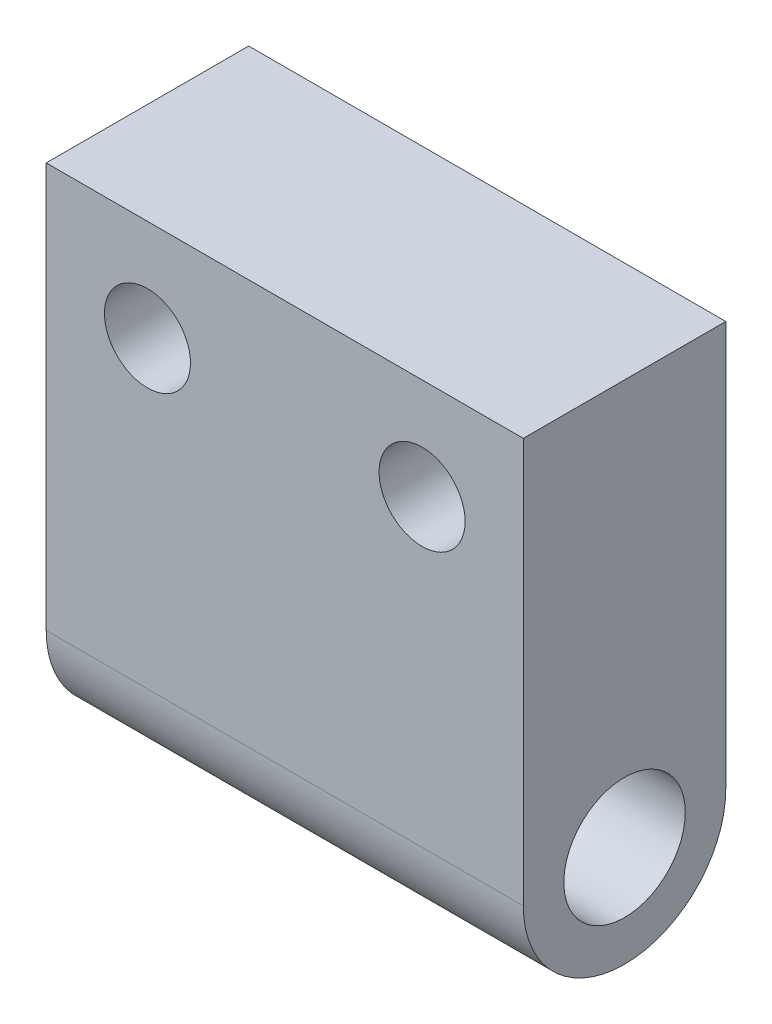
ISO-10303-21;
HEADER;
FILE_DESCRIPTION(('STEP AP214'),'2;1');
FILE_NAME('part.step','',(''),(''),'','','');
FILE_SCHEMA(('AUTOMOTIVE_DESIGN { 1 0 10303 214 1 1 1 1 }'));
ENDSEC;
DATA;
#1=APPLICATION_CONTEXT('core data for automotive mechanical design processes');
#2=APPLICATION_PROTOCOL_DEFINITION('international standard','automotive_design',2000,#1);
#3=PRODUCT_CONTEXT('',#1,'mechanical');
#4=PRODUCT('Part','Part','',(#3));
#5=PRODUCT_RELATED_PRODUCT_CATEGORY('part','',(#4));
#6=PRODUCT_DEFINITION_FORMATION('','',#4);
#7=PRODUCT_DEFINITION_CONTEXT('part definition',#1,'design');
#8=PRODUCT_DEFINITION('design','',#6,#7);
#9=PRODUCT_DEFINITION_SHAPE('','',#8);
#10=(LENGTH_UNIT() NAMED_UNIT(*) SI_UNIT(.MILLI.,.METRE.));
#11=(NAMED_UNIT(*) PLANE_ANGLE_UNIT() SI_UNIT($,.RADIAN.));
#12=(NAMED_UNIT(*) SI_UNIT($,.STERADIAN.) SOLID_ANGLE_UNIT());
#13=UNCERTAINTY_MEASURE_WITH_UNIT(LENGTH_MEASURE(1.E-05),#10,'distance_accuracy_value','');
#14=(GEOMETRIC_REPRESENTATION_CONTEXT(3) GLOBAL_UNCERTAINTY_ASSIGNED_CONTEXT((#13)) GLOBAL_UNIT_ASSIGNED_CONTEXT((#10,
#11,#12)) REPRESENTATION_CONTEXT('',''));
#15=CARTESIAN_POINT('',(0.,0.,0.));
#16=DIRECTION('',(0.,0.,1.));
#17=DIRECTION('',(1.,0.,0.));
#18=AXIS2_PLACEMENT_3D('',#15,#16,#17);
#19=CARTESIAN_POINT('',(47.1297055354398,10.,10.));
#20=DIRECTION('',(1.,0.,0.));
#21=DIRECTION('',(0.,0.,-1.));
#22=AXIS2_PLACEMENT_3D('',#19,#20,#21);
#23=CYLINDRICAL_SURFACE('',#22,4.24999999999999);
#24=CARTESIAN_POINT('',(10.,10.,10.));
#25=DIRECTION('',(-1.,0.,0.));
#26=DIRECTION('',(0.,0.,1.));
#27=AXIS2_PLACEMENT_3D('',#24,#25,#26);
#28=CIRCLE('',#27,4.24999999999999);
#29=CARTESIAN_POINT('',(10.,10.,14.25));
#30=VERTEX_POINT('',#29);
#31=EDGE_CURVE('E108',#30,#30,#28,.F.);
#32=ORIENTED_EDGE('',*,*,#31,.F.);
#33=EDGE_LOOP('',(#32));
#34=FACE_BOUND('',#33,.T.);
#35=CARTESIAN_POINT('',(37.1297055354398,10.,10.));
#36=DIRECTION('',(1.,0.,0.));
#37=DIRECTION('',(0.,0.,-1.));
#38=AXIS2_PLACEMENT_3D('',#35,#36,#37);
#39=CIRCLE('',#38,4.24999999999999);
#40=CARTESIAN_POINT('',(37.1297055354398,10.,5.75000000000001));
#41=VERTEX_POINT('',#40);
#42=EDGE_CURVE('E115',#41,#41,#39,.F.);
#43=ORIENTED_EDGE('',*,*,#42,.F.);
#44=EDGE_LOOP('',(#43));
#45=FACE_BOUND('',#44,.T.);
#46=ADVANCED_FACE('F31',(#34,#45),#23,.F.);
#47=CARTESIAN_POINT('',(0.,0.,20.));
#48=DIRECTION('',(1.,0.,0.));
#49=DIRECTION('',(0.,0.,-1.));
#50=AXIS2_PLACEMENT_3D('',#47,#48,#49);
#51=PLANE('',#50);
#52=CARTESIAN_POINT('',(0.,10.,10.));
#53=DIRECTION('',(-1.,0.,0.));
#54=DIRECTION('',(0.,0.,1.));
#55=AXIS2_PLACEMENT_3D('',#52,#53,#54);
#56=CIRCLE('',#55,6.);
#57=CARTESIAN_POINT('',(0.,10.,16.));
#58=VERTEX_POINT('',#57);
#59=EDGE_CURVE('E118',#58,#58,#56,.T.);
#60=ORIENTED_EDGE('',*,*,#59,.F.);
#61=EDGE_LOOP('',(#60));
#62=FACE_BOUND('',#61,.T.);
#63=CARTESIAN_POINT('',(0.,10.,10.));
#64=DIRECTION('',(1.,0.,0.));
#65=DIRECTION('',(0.,0.,-1.));
#66=AXIS2_PLACEMENT_3D('',#63,#64,#65);
#67=CIRCLE('',#66,10.);
#68=CARTESIAN_POINT('',(0.,10.,0.));
#69=VERTEX_POINT('',#68);
#70=CARTESIAN_POINT('',(0.,0.,10.));
#71=VERTEX_POINT('',#70);
#72=EDGE_CURVE('E47',#69,#71,#67,.F.);
#73=ORIENTED_EDGE('',*,*,#72,.T.);
#74=CARTESIAN_POINT('',(0.,10.,10.));
#75=DIRECTION('',(1.,0.,0.));
#76=DIRECTION('',(0.,0.,-1.));
#77=AXIS2_PLACEMENT_3D('',#74,#75,#76);
#78=CIRCLE('',#77,10.);
#79=CARTESIAN_POINT('',(0.,10.,20.));
#80=VERTEX_POINT('',#79);
#81=EDGE_CURVE('E40',#71,#80,#78,.F.);
#82=ORIENTED_EDGE('',*,*,#81,.T.);
#83=DIRECTION('',(0.,-1.,0.));
#84=VECTOR('',#83,1.);
#85=CARTESIAN_POINT('',(0.,0.,20.));
#86=LINE('',#85,#84);
#87=CARTESIAN_POINT('',(0.,50.,20.));
#88=VERTEX_POINT('',#87);
#89=EDGE_CURVE('E89',#88,#80,#86,.T.);
#90=ORIENTED_EDGE('',*,*,#89,.F.);
#91=DIRECTION('',(0.,0.,-1.));
#92=VECTOR('',#91,1.);
#93=CARTESIAN_POINT('',(0.,50.,20.));
#94=LINE('',#93,#92);
#95=CARTESIAN_POINT('',(0.,50.,0.));
#96=VERTEX_POINT('',#95);
#97=EDGE_CURVE('E97',#88,#96,#94,.T.);
#98=ORIENTED_EDGE('',*,*,#97,.T.);
#99=DIRECTION('',(0.,-1.,0.));
#100=VECTOR('',#99,1.);
#101=CARTESIAN_POINT('',(0.,0.,0.));
#102=LINE('',#101,#100);
#103=EDGE_CURVE('E106',#96,#69,#102,.T.);
#104=ORIENTED_EDGE('',*,*,#103,.T.);
#105=EDGE_LOOP('',(#73,#82,#90,#98,#104));
#106=FACE_BOUND('',#105,.T.);
#107=ADVANCED_FACE('F127',(#62,#106),#51,.F.);
#108=CARTESIAN_POINT('',(47.1297055354398,0.,20.));
#109=DIRECTION('',(-1.,0.,0.));
#110=DIRECTION('',(0.,0.,1.));
#111=AXIS2_PLACEMENT_3D('',#108,#109,#110);
#112=PLANE('',#111);
#113=CARTESIAN_POINT('',(47.1297055354398,10.,10.));
#114=DIRECTION('',(1.,0.,0.));
#115=DIRECTION('',(0.,0.,-1.));
#116=AXIS2_PLACEMENT_3D('',#113,#114,#115);
#117=CIRCLE('',#116,6.);
#118=CARTESIAN_POINT('',(47.1297055354398,10.,4.));
#119=VERTEX_POINT('',#118);
#120=EDGE_CURVE('E148',#119,#119,#117,.T.);
#121=ORIENTED_EDGE('',*,*,#120,.F.);
#122=EDGE_LOOP('',(#121));
#123=FACE_BOUND('',#122,.T.);
#124=DIRECTION('',(0.,1.,0.));
#125=VECTOR('',#124,1.);
#126=CARTESIAN_POINT('',(47.1297055354398,0.,20.));
#127=LINE('',#126,#125);
#128=CARTESIAN_POINT('',(47.1297055354398,10.,20.));
#129=VERTEX_POINT('',#128);
#130=CARTESIAN_POINT('',(47.1297055354398,50.,20.));
#131=VERTEX_POINT('',#130);
#132=EDGE_CURVE('E79',#129,#131,#127,.T.);
#133=ORIENTED_EDGE('',*,*,#132,.F.);
#134=CARTESIAN_POINT('',(47.1297055354398,10.,10.));
#135=DIRECTION('',(-1.,0.,0.));
#136=DIRECTION('',(0.,0.,1.));
#137=AXIS2_PLACEMENT_3D('',#134,#135,#136);
#138=CIRCLE('',#137,10.);
#139=CARTESIAN_POINT('',(47.1297055354398,0.,10.));
#140=VERTEX_POINT('',#139);
#141=EDGE_CURVE('E123',#129,#140,#138,.F.);
#142=ORIENTED_EDGE('',*,*,#141,.T.);
#143=CARTESIAN_POINT('',(47.1297055354398,10.,10.));
#144=DIRECTION('',(-1.,0.,0.));
#145=DIRECTION('',(0.,0.,1.));
#146=AXIS2_PLACEMENT_3D('',#143,#144,#145);
#147=CIRCLE('',#146,10.);
#148=CARTESIAN_POINT('',(47.1297055354398,10.,0.));
#149=VERTEX_POINT('',#148);
#150=EDGE_CURVE('E121',#140,#149,#147,.F.);
#151=ORIENTED_EDGE('',*,*,#150,.T.);
#152=DIRECTION('',(0.,1.,0.));
#153=VECTOR('',#152,1.);
#154=CARTESIAN_POINT('',(47.1297055354398,0.,0.));
#155=LINE('',#154,#153);
#156=CARTESIAN_POINT('',(47.1297055354398,50.,0.));
#157=VERTEX_POINT('',#156);
#158=EDGE_CURVE('E94',#149,#157,#155,.T.);
#159=ORIENTED_EDGE('',*,*,#158,.T.);
#160=DIRECTION('',(0.,0.,-1.));
#161=VECTOR('',#160,1.);
#162=CARTESIAN_POINT('',(47.1297055354398,50.,20.));
#163=LINE('',#162,#161);
#164=EDGE_CURVE('E92',#131,#157,#163,.T.);
#165=ORIENTED_EDGE('',*,*,#164,.F.);
#166=EDGE_LOOP('',(#133,#142,#151,#159,#165));
#167=FACE_BOUND('',#166,.T.);
#168=ADVANCED_FACE('F93',(#123,#167),#112,.F.);
#169=CARTESIAN_POINT('',(0.,50.,20.));
#170=DIRECTION('',(0.,-1.,0.));
#171=DIRECTION('',(0.,0.,-1.));
#172=AXIS2_PLACEMENT_3D('',#169,#170,#171);
#173=PLANE('',#172);
#174=DIRECTION('',(-1.,0.,0.));
#175=VECTOR('',#174,1.);
#176=CARTESIAN_POINT('',(0.,50.,0.));
#177=LINE('',#176,#175);
#178=EDGE_CURVE('E110',#157,#96,#177,.T.);
#179=ORIENTED_EDGE('',*,*,#178,.T.);
#180=ORIENTED_EDGE('',*,*,#97,.F.);
#181=DIRECTION('',(-1.,0.,0.));
#182=VECTOR('',#181,1.);
#183=CARTESIAN_POINT('',(0.,50.,20.));
#184=LINE('',#183,#182);
#185=EDGE_CURVE('E84',#131,#88,#184,.T.);
#186=ORIENTED_EDGE('',*,*,#185,.F.);
#187=ORIENTED_EDGE('',*,*,#164,.T.);
#188=EDGE_LOOP('',(#179,#180,#186,#187));
#189=FACE_BOUND('',#188,.T.);
#190=ADVANCED_FACE('F99',(#189),#173,.F.);
#191=CARTESIAN_POINT('',(0.,50.,20.));
#192=DIRECTION('',(0.,0.,-1.));
#193=DIRECTION('',(-1.,0.,0.));
#194=AXIS2_PLACEMENT_3D('',#191,#192,#193);
#195=PLANE('',#194);
#196=CARTESIAN_POINT('',(37.1297055354398,40.,20.));
#197=DIRECTION('',(0.,0.,1.));
#198=DIRECTION('',(1.,0.,0.));
#199=AXIS2_PLACEMENT_3D('',#196,#197,#198);
#200=CIRCLE('',#199,4.24999999999999);
#201=CARTESIAN_POINT('',(41.3797055354398,40.,20.));
#202=VERTEX_POINT('',#201);
#203=EDGE_CURVE('E133',#202,#202,#200,.T.);
#204=ORIENTED_EDGE('',*,*,#203,.F.);
#205=EDGE_LOOP('',(#204));
#206=FACE_BOUND('',#205,.T.);
#207=CARTESIAN_POINT('',(10.,40.,20.));
#208=DIRECTION('',(0.,0.,1.));
#209=DIRECTION('',(1.,0.,0.));
#210=AXIS2_PLACEMENT_3D('',#207,#208,#209);
#211=CIRCLE('',#210,4.24999999999999);
#212=CARTESIAN_POINT('',(14.25,40.,20.));
#213=VERTEX_POINT('',#212);
#214=EDGE_CURVE('E140',#213,#213,#211,.T.);
#215=ORIENTED_EDGE('',*,*,#214,.F.);
#216=EDGE_LOOP('',(#215));
#217=FACE_BOUND('',#216,.T.);
#218=ORIENTED_EDGE('',*,*,#89,.T.);
#219=DIRECTION('',(1.,0.,0.));
#220=VECTOR('',#219,1.);
#221=CARTESIAN_POINT('',(0.,10.,20.));
#222=LINE('',#221,#220);
#223=EDGE_CURVE('E87',#80,#129,#222,.T.);
#224=ORIENTED_EDGE('',*,*,#223,.T.);
#225=ORIENTED_EDGE('',*,*,#132,.T.);
#226=ORIENTED_EDGE('',*,*,#185,.T.);
#227=EDGE_LOOP('',(#218,#224,#225,#226));
#228=FACE_BOUND('',#227,.T.);
#229=ADVANCED_FACE('F82',(#206,#217,#228),#195,.F.);
#230=CARTESIAN_POINT('',(0.,50.,0.));
#231=DIRECTION('',(0.,0.,-1.));
#232=DIRECTION('',(-1.,0.,0.));
#233=AXIS2_PLACEMENT_3D('',#230,#231,#232);
#234=PLANE('',#233);
#235=CARTESIAN_POINT('',(37.1297055354398,40.,0.));
#236=DIRECTION('',(0.,0.,1.));
#237=DIRECTION('',(1.,0.,0.));
#238=AXIS2_PLACEMENT_3D('',#235,#236,#237);
#239=CIRCLE('',#238,4.25);
#240=CARTESIAN_POINT('',(41.3797055354398,40.,0.));
#241=VERTEX_POINT('',#240);
#242=EDGE_CURVE('E135',#241,#241,#239,.T.);
#243=ORIENTED_EDGE('',*,*,#242,.T.);
#244=EDGE_LOOP('',(#243));
#245=FACE_BOUND('',#244,.T.);
#246=CARTESIAN_POINT('',(10.,40.,0.));
#247=DIRECTION('',(0.,0.,1.));
#248=DIRECTION('',(1.,0.,0.));
#249=AXIS2_PLACEMENT_3D('',#246,#247,#248);
#250=CIRCLE('',#249,4.24999999999999);
#251=CARTESIAN_POINT('',(14.25,40.,0.));
#252=VERTEX_POINT('',#251);
#253=EDGE_CURVE('E145',#252,#252,#250,.T.);
#254=ORIENTED_EDGE('',*,*,#253,.T.);
#255=EDGE_LOOP('',(#254));
#256=FACE_BOUND('',#255,.T.);
#257=ORIENTED_EDGE('',*,*,#158,.F.);
#258=DIRECTION('',(1.,0.,0.));
#259=VECTOR('',#258,1.);
#260=CARTESIAN_POINT('',(0.,10.,0.));
#261=LINE('',#260,#259);
#262=EDGE_CURVE('E11',#149,#69,#261,.F.);
#263=ORIENTED_EDGE('',*,*,#262,.T.);
#264=ORIENTED_EDGE('',*,*,#103,.F.);
#265=ORIENTED_EDGE('',*,*,#178,.F.);
#266=EDGE_LOOP('',(#257,#263,#264,#265));
#267=FACE_BOUND('',#266,.T.);
#268=ADVANCED_FACE('F200',(#245,#256,#267),#234,.T.);
#269=CARTESIAN_POINT('',(10.,10.,10.));
#270=DIRECTION('',(-1.,0.,0.));
#271=DIRECTION('',(0.,0.,1.));
#272=AXIS2_PLACEMENT_3D('',#269,#270,#271);
#273=PLANE('',#272);
#274=CARTESIAN_POINT('',(10.,10.,10.));
#275=DIRECTION('',(-1.,0.,0.));
#276=DIRECTION('',(0.,0.,1.));
#277=AXIS2_PLACEMENT_3D('',#274,#275,#276);
#278=CIRCLE('',#277,6.);
#279=CARTESIAN_POINT('',(10.,10.,16.));
#280=VERTEX_POINT('',#279);
#281=EDGE_CURVE('E114',#280,#280,#278,.T.);
#282=ORIENTED_EDGE('',*,*,#281,.T.);
#283=EDGE_LOOP('',(#282));
#284=FACE_BOUND('',#283,.T.);
#285=ORIENTED_EDGE('',*,*,#31,.T.);
#286=EDGE_LOOP('',(#285));
#287=FACE_BOUND('',#286,.T.);
#288=ADVANCED_FACE('F197',(#284,#287),#273,.T.);
#289=CARTESIAN_POINT('',(10.,10.,10.));
#290=DIRECTION('',(-1.,0.,0.));
#291=DIRECTION('',(0.,0.,1.));
#292=AXIS2_PLACEMENT_3D('',#289,#290,#291);
#293=CYLINDRICAL_SURFACE('',#292,6.);
#294=ORIENTED_EDGE('',*,*,#281,.F.);
#295=EDGE_LOOP('',(#294));
#296=FACE_BOUND('',#295,.T.);
#297=ORIENTED_EDGE('',*,*,#59,.T.);
#298=EDGE_LOOP('',(#297));
#299=FACE_BOUND('',#298,.T.);
#300=ADVANCED_FACE('F158',(#296,#299),#293,.F.);
#301=CARTESIAN_POINT('',(37.1297055354398,10.,10.));
#302=DIRECTION('',(1.,0.,0.));
#303=DIRECTION('',(0.,0.,-1.));
#304=AXIS2_PLACEMENT_3D('',#301,#302,#303);
#305=PLANE('',#304);
#306=CARTESIAN_POINT('',(37.1297055354398,10.,10.));
#307=DIRECTION('',(1.,0.,0.));
#308=DIRECTION('',(0.,0.,-1.));
#309=AXIS2_PLACEMENT_3D('',#306,#307,#308);
#310=CIRCLE('',#309,6.);
#311=CARTESIAN_POINT('',(37.1297055354398,10.,4.));
#312=VERTEX_POINT('',#311);
#313=EDGE_CURVE('E119',#312,#312,#310,.T.);
#314=ORIENTED_EDGE('',*,*,#313,.T.);
#315=EDGE_LOOP('',(#314));
#316=FACE_BOUND('',#315,.T.);
#317=ORIENTED_EDGE('',*,*,#42,.T.);
#318=EDGE_LOOP('',(#317));
#319=FACE_BOUND('',#318,.T.);
#320=ADVANCED_FACE('F190',(#316,#319),#305,.T.);
#321=CARTESIAN_POINT('',(37.1297055354398,10.,10.));
#322=DIRECTION('',(1.,0.,0.));
#323=DIRECTION('',(0.,0.,-1.));
#324=AXIS2_PLACEMENT_3D('',#321,#322,#323);
#325=CYLINDRICAL_SURFACE('',#324,6.);
#326=ORIENTED_EDGE('',*,*,#313,.F.);
#327=EDGE_LOOP('',(#326));
#328=FACE_BOUND('',#327,.T.);
#329=ORIENTED_EDGE('',*,*,#120,.T.);
#330=EDGE_LOOP('',(#329));
#331=FACE_BOUND('',#330,.T.);
#332=ADVANCED_FACE('F185',(#328,#331),#325,.F.);
#333=CARTESIAN_POINT('',(10.,40.,20.));
#334=DIRECTION('',(0.,0.,1.));
#335=DIRECTION('',(1.,0.,0.));
#336=AXIS2_PLACEMENT_3D('',#333,#334,#335);
#337=CYLINDRICAL_SURFACE('',#336,4.24999999999999);
#338=ORIENTED_EDGE('',*,*,#253,.F.);
#339=EDGE_LOOP('',(#338));
#340=FACE_BOUND('',#339,.T.);
#341=ORIENTED_EDGE('',*,*,#214,.T.);
#342=EDGE_LOOP('',(#341));
#343=FACE_BOUND('',#342,.T.);
#344=ADVANCED_FACE('F179',(#340,#343),#337,.F.);
#345=CARTESIAN_POINT('',(37.1297055354398,40.,20.));
#346=DIRECTION('',(0.,0.,1.));
#347=DIRECTION('',(1.,0.,0.));
#348=AXIS2_PLACEMENT_3D('',#345,#346,#347);
#349=CYLINDRICAL_SURFACE('',#348,4.24999999999999);
#350=ORIENTED_EDGE('',*,*,#242,.F.);
#351=EDGE_LOOP('',(#350));
#352=FACE_BOUND('',#351,.T.);
#353=ORIENTED_EDGE('',*,*,#203,.T.);
#354=EDGE_LOOP('',(#353));
#355=FACE_BOUND('',#354,.T.);
#356=ADVANCED_FACE('F175',(#352,#355),#349,.F.);
#357=CARTESIAN_POINT('',(0.,10.,10.));
#358=DIRECTION('',(-1.,0.,0.));
#359=DIRECTION('',(0.,0.,1.));
#360=AXIS2_PLACEMENT_3D('',#357,#358,#359);
#361=CYLINDRICAL_SURFACE('',#360,10.);
#362=DIRECTION('',(1.,0.,0.));
#363=VECTOR('',#362,1.);
#364=CARTESIAN_POINT('',(47.1297055354398,0.,10.));
#365=LINE('',#364,#363);
#366=EDGE_CURVE('E35',#71,#140,#365,.T.);
#367=ORIENTED_EDGE('',*,*,#366,.F.);
#368=ORIENTED_EDGE('',*,*,#72,.F.);
#369=ORIENTED_EDGE('',*,*,#262,.F.);
#370=ORIENTED_EDGE('',*,*,#150,.F.);
#371=EDGE_LOOP('',(#367,#368,#369,#370));
#372=FACE_BOUND('',#371,.T.);
#373=ADVANCED_FACE('F33',(#372),#361,.T.);
#374=CARTESIAN_POINT('',(0.,10.,10.));
#375=DIRECTION('',(1.,0.,0.));
#376=DIRECTION('',(0.,0.,-1.));
#377=AXIS2_PLACEMENT_3D('',#374,#375,#376);
#378=CYLINDRICAL_SURFACE('',#377,10.);
#379=ORIENTED_EDGE('',*,*,#81,.F.);
#380=ORIENTED_EDGE('',*,*,#366,.T.);
#381=ORIENTED_EDGE('',*,*,#141,.F.);
#382=ORIENTED_EDGE('',*,*,#223,.F.);
#383=EDGE_LOOP('',(#379,#380,#381,#382));
#384=FACE_BOUND('',#383,.T.);
#385=ADVANCED_FACE('F130',(#384),#378,.T.);
#386=CLOSED_SHELL('',(#46,#107,#168,#190,#229,#268,#288,#300,#320,#332,#344,#356,#373,#385));
#387=MANIFOLD_SOLID_BREP('B2',#386);
#388=ADVANCED_BREP_SHAPE_REPRESENTATION('',(#18,#387),#14);
#389=SHAPE_DEFINITION_REPRESENTATION(#9,#388);
ENDSEC;
END-ISO-10303-21;
